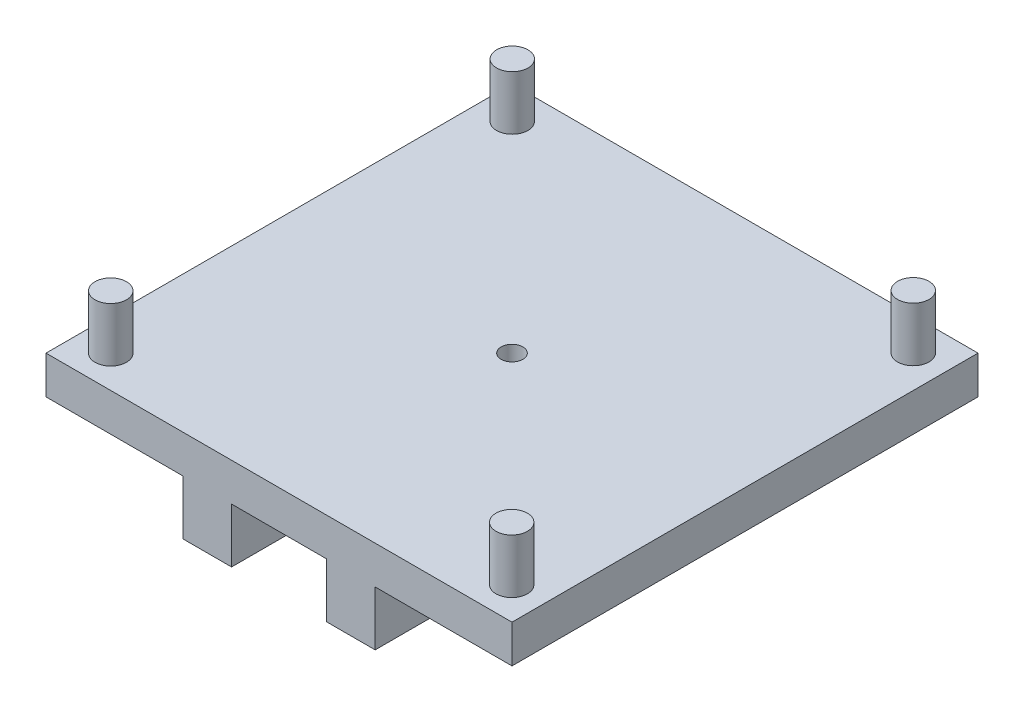
ISO-10303-21;
HEADER;
FILE_DESCRIPTION(('STEP AP214'),'2;1');
FILE_NAME('part.step','',(''),(''),'','','');
FILE_SCHEMA(('AUTOMOTIVE_DESIGN { 1 0 10303 214 1 1 1 1 }'));
ENDSEC;
DATA;
#1=APPLICATION_CONTEXT('core data for automotive mechanical design processes');
#2=APPLICATION_PROTOCOL_DEFINITION('international standard','automotive_design',2000,#1);
#3=PRODUCT_CONTEXT('',#1,'mechanical');
#4=PRODUCT('Part','Part','',(#3));
#5=PRODUCT_RELATED_PRODUCT_CATEGORY('part','',(#4));
#6=PRODUCT_DEFINITION_FORMATION('','',#4);
#7=PRODUCT_DEFINITION_CONTEXT('part definition',#1,'design');
#8=PRODUCT_DEFINITION('design','',#6,#7);
#9=PRODUCT_DEFINITION_SHAPE('','',#8);
#10=(LENGTH_UNIT() NAMED_UNIT(*) SI_UNIT(.MILLI.,.METRE.));
#11=(NAMED_UNIT(*) PLANE_ANGLE_UNIT() SI_UNIT($,.RADIAN.));
#12=(NAMED_UNIT(*) SI_UNIT($,.STERADIAN.) SOLID_ANGLE_UNIT());
#13=UNCERTAINTY_MEASURE_WITH_UNIT(LENGTH_MEASURE(1.E-05),#10,'distance_accuracy_value','');
#14=(GEOMETRIC_REPRESENTATION_CONTEXT(3) GLOBAL_UNCERTAINTY_ASSIGNED_CONTEXT((#13)) GLOBAL_UNIT_ASSIGNED_CONTEXT((#10,
#11,#12)) REPRESENTATION_CONTEXT('',''));
#15=CARTESIAN_POINT('',(0.,0.,0.));
#16=DIRECTION('',(0.,0.,1.));
#17=DIRECTION('',(1.,0.,0.));
#18=AXIS2_PLACEMENT_3D('',#15,#16,#17);
#19=CARTESIAN_POINT('',(0.,0.,0.));
#20=DIRECTION('',(0.,-1.,0.));
#21=DIRECTION('',(0.,0.,-1.));
#22=AXIS2_PLACEMENT_3D('',#19,#20,#21);
#23=PLANE('',#22);
#24=DIRECTION('',(0.,0.,1.));
#25=VECTOR('',#24,1.);
#26=CARTESIAN_POINT('',(4.375,0.,21.5));
#27=LINE('',#26,#25);
#28=CARTESIAN_POINT('',(4.375,0.,-21.5));
#29=VERTEX_POINT('',#28);
#30=CARTESIAN_POINT('',(4.375,0.,21.5));
#31=VERTEX_POINT('',#30);
#32=EDGE_CURVE('E133',#29,#31,#27,.T.);
#33=ORIENTED_EDGE('',*,*,#32,.T.);
#34=DIRECTION('',(1.,0.,0.));
#35=VECTOR('',#34,1.);
#36=CARTESIAN_POINT('',(-21.5,0.,21.5));
#37=LINE('',#36,#35);
#38=CARTESIAN_POINT('',(-4.375,0.,21.5));
#39=VERTEX_POINT('',#38);
#40=EDGE_CURVE('E233',#39,#31,#37,.T.);
#41=ORIENTED_EDGE('',*,*,#40,.F.);
#42=DIRECTION('',(0.,0.,1.));
#43=VECTOR('',#42,1.);
#44=CARTESIAN_POINT('',(-4.375,0.,21.5));
#45=LINE('',#44,#43);
#46=CARTESIAN_POINT('',(-4.375,0.,-21.5));
#47=VERTEX_POINT('',#46);
#48=EDGE_CURVE('E135',#47,#39,#45,.T.);
#49=ORIENTED_EDGE('',*,*,#48,.F.);
#50=DIRECTION('',(-1.,0.,0.));
#51=VECTOR('',#50,1.);
#52=CARTESIAN_POINT('',(-21.5,0.,-21.5));
#53=LINE('',#52,#51);
#54=EDGE_CURVE('E60',#29,#47,#53,.T.);
#55=ORIENTED_EDGE('',*,*,#54,.F.);
#56=EDGE_LOOP('',(#33,#41,#49,#55));
#57=FACE_BOUND('',#56,.T.);
#58=CARTESIAN_POINT('',(0.,0.,0.));
#59=DIRECTION('',(0.,1.,0.));
#60=DIRECTION('',(0.,0.,1.));
#61=AXIS2_PLACEMENT_3D('',#58,#59,#60);
#62=CIRCLE('',#61,1.);
#63=CARTESIAN_POINT('',(0.,0.,1.));
#64=VERTEX_POINT('',#63);
#65=EDGE_CURVE('E205',#64,#64,#62,.T.);
#66=ORIENTED_EDGE('',*,*,#65,.T.);
#67=EDGE_LOOP('',(#66));
#68=FACE_BOUND('',#67,.T.);
#69=ADVANCED_FACE('F37',(#57,#68),#23,.T.);
#70=DIRECTION('',(0.,0.,-1.));
#71=VECTOR('',#70,1.);
#72=CARTESIAN_POINT('',(8.875,0.,21.5));
#73=LINE('',#72,#71);
#74=CARTESIAN_POINT('',(8.875,0.,21.5));
#75=VERTEX_POINT('',#74);
#76=CARTESIAN_POINT('',(8.87499999999999,0.,-21.5));
#77=VERTEX_POINT('',#76);
#78=EDGE_CURVE('E52',#75,#77,#73,.T.);
#79=ORIENTED_EDGE('',*,*,#78,.T.);
#80=CARTESIAN_POINT('',(21.5,0.,-21.5));
#81=VERTEX_POINT('',#80);
#82=EDGE_CURVE('E226',#81,#77,#53,.T.);
#83=ORIENTED_EDGE('',*,*,#82,.F.);
#84=DIRECTION('',(0.,0.,-1.));
#85=VECTOR('',#84,1.);
#86=CARTESIAN_POINT('',(21.5,0.,21.5));
#87=LINE('',#86,#85);
#88=CARTESIAN_POINT('',(21.5,0.,21.5));
#89=VERTEX_POINT('',#88);
#90=EDGE_CURVE('E209',#89,#81,#87,.T.);
#91=ORIENTED_EDGE('',*,*,#90,.F.);
#92=EDGE_CURVE('E230',#75,#89,#37,.T.);
#93=ORIENTED_EDGE('',*,*,#92,.F.);
#94=EDGE_LOOP('',(#79,#83,#91,#93));
#95=FACE_BOUND('',#94,.T.);
#96=ADVANCED_FACE('F253',(#95),#23,.T.);
#97=CARTESIAN_POINT('',(0.,3.5,0.));
#98=DIRECTION('',(0.,-1.,0.));
#99=DIRECTION('',(0.,0.,-1.));
#100=AXIS2_PLACEMENT_3D('',#97,#98,#99);
#101=PLANE('',#100);
#102=CARTESIAN_POINT('',(18.5,3.5,18.5270414754577));
#103=DIRECTION('',(0.,-1.,0.));
#104=DIRECTION('',(0.,0.,-1.));
#105=AXIS2_PLACEMENT_3D('',#102,#103,#104);
#106=CIRCLE('',#105,1.45);
#107=CARTESIAN_POINT('',(18.5,3.5,17.0770414754577));
#108=VERTEX_POINT('',#107);
#109=EDGE_CURVE('E11',#108,#108,#106,.F.);
#110=ORIENTED_EDGE('',*,*,#109,.F.);
#111=EDGE_LOOP('',(#110));
#112=FACE_BOUND('',#111,.T.);
#113=CARTESIAN_POINT('',(-18.5,3.5,18.5270414754577));
#114=DIRECTION('',(0.,-1.,0.));
#115=DIRECTION('',(0.,0.,-1.));
#116=AXIS2_PLACEMENT_3D('',#113,#114,#115);
#117=CIRCLE('',#116,1.45);
#118=CARTESIAN_POINT('',(-18.5,3.5,17.0770414754577));
#119=VERTEX_POINT('',#118);
#120=EDGE_CURVE('E190',#119,#119,#117,.T.);
#121=ORIENTED_EDGE('',*,*,#120,.T.);
#122=EDGE_LOOP('',(#121));
#123=FACE_BOUND('',#122,.T.);
#124=CARTESIAN_POINT('',(18.5,3.5,-18.5270414754577));
#125=DIRECTION('',(0.,-1.,0.));
#126=DIRECTION('',(0.,0.,1.));
#127=AXIS2_PLACEMENT_3D('',#124,#125,#126);
#128=CIRCLE('',#127,1.45);
#129=CARTESIAN_POINT('',(18.5,3.5,-17.0770414754577));
#130=VERTEX_POINT('',#129);
#131=EDGE_CURVE('E194',#130,#130,#128,.T.);
#132=ORIENTED_EDGE('',*,*,#131,.T.);
#133=EDGE_LOOP('',(#132));
#134=FACE_BOUND('',#133,.T.);
#135=CARTESIAN_POINT('',(-18.5,3.5,-18.5270414754577));
#136=DIRECTION('',(0.,-1.,0.));
#137=DIRECTION('',(0.,0.,-1.));
#138=AXIS2_PLACEMENT_3D('',#135,#136,#137);
#139=CIRCLE('',#138,1.45);
#140=CARTESIAN_POINT('',(-18.5,3.5,-19.9770414754577));
#141=VERTEX_POINT('',#140);
#142=EDGE_CURVE('E45',#141,#141,#139,.F.);
#143=ORIENTED_EDGE('',*,*,#142,.F.);
#144=EDGE_LOOP('',(#143));
#145=FACE_BOUND('',#144,.T.);
#146=DIRECTION('',(0.,0.,-1.));
#147=VECTOR('',#146,1.);
#148=CARTESIAN_POINT('',(21.5,3.5,21.5));
#149=LINE('',#148,#147);
#150=CARTESIAN_POINT('',(21.5,3.5,21.5));
#151=VERTEX_POINT('',#150);
#152=CARTESIAN_POINT('',(21.5,3.5,-21.5));
#153=VERTEX_POINT('',#152);
#154=EDGE_CURVE('E212',#151,#153,#149,.T.);
#155=ORIENTED_EDGE('',*,*,#154,.T.);
#156=DIRECTION('',(-1.,0.,0.));
#157=VECTOR('',#156,1.);
#158=CARTESIAN_POINT('',(-21.5,3.5,-21.5));
#159=LINE('',#158,#157);
#160=CARTESIAN_POINT('',(-21.5,3.5,-21.5));
#161=VERTEX_POINT('',#160);
#162=EDGE_CURVE('E215',#153,#161,#159,.T.);
#163=ORIENTED_EDGE('',*,*,#162,.T.);
#164=DIRECTION('',(0.,0.,1.));
#165=VECTOR('',#164,1.);
#166=CARTESIAN_POINT('',(-21.5,3.5,21.5));
#167=LINE('',#166,#165);
#168=CARTESIAN_POINT('',(-21.5,3.5,21.5));
#169=VERTEX_POINT('',#168);
#170=EDGE_CURVE('E218',#161,#169,#167,.T.);
#171=ORIENTED_EDGE('',*,*,#170,.T.);
#172=DIRECTION('',(1.,0.,0.));
#173=VECTOR('',#172,1.);
#174=CARTESIAN_POINT('',(-21.5,3.5,21.5));
#175=LINE('',#174,#173);
#176=EDGE_CURVE('E220',#169,#151,#175,.T.);
#177=ORIENTED_EDGE('',*,*,#176,.T.);
#178=EDGE_LOOP('',(#155,#163,#171,#177));
#179=FACE_BOUND('',#178,.T.);
#180=CARTESIAN_POINT('',(0.,3.5,0.));
#181=DIRECTION('',(0.,1.,0.));
#182=DIRECTION('',(0.,0.,1.));
#183=AXIS2_PLACEMENT_3D('',#180,#181,#182);
#184=CIRCLE('',#183,1.);
#185=CARTESIAN_POINT('',(0.,3.5,1.));
#186=VERTEX_POINT('',#185);
#187=EDGE_CURVE('E206',#186,#186,#184,.T.);
#188=ORIENTED_EDGE('',*,*,#187,.F.);
#189=EDGE_LOOP('',(#188));
#190=FACE_BOUND('',#189,.T.);
#191=ADVANCED_FACE('F249',(#112,#123,#134,#145,#179,#190),#101,.F.);
#192=DIRECTION('',(0.,0.,-1.));
#193=VECTOR('',#192,1.);
#194=CARTESIAN_POINT('',(-8.875,0.,21.5));
#195=LINE('',#194,#193);
#196=CARTESIAN_POINT('',(-8.875,0.,21.5));
#197=VERTEX_POINT('',#196);
#198=CARTESIAN_POINT('',(-8.87499999999999,0.,-21.5));
#199=VERTEX_POINT('',#198);
#200=EDGE_CURVE('E165',#197,#199,#195,.T.);
#201=ORIENTED_EDGE('',*,*,#200,.F.);
#202=CARTESIAN_POINT('',(-21.5,0.,21.5));
#203=VERTEX_POINT('',#202);
#204=EDGE_CURVE('E216',#203,#197,#37,.T.);
#205=ORIENTED_EDGE('',*,*,#204,.F.);
#206=DIRECTION('',(0.,0.,1.));
#207=VECTOR('',#206,1.);
#208=CARTESIAN_POINT('',(-21.5,0.,21.5));
#209=LINE('',#208,#207);
#210=CARTESIAN_POINT('',(-21.5,0.,-21.5));
#211=VERTEX_POINT('',#210);
#212=EDGE_CURVE('E228',#211,#203,#209,.T.);
#213=ORIENTED_EDGE('',*,*,#212,.F.);
#214=EDGE_CURVE('E225',#199,#211,#53,.T.);
#215=ORIENTED_EDGE('',*,*,#214,.F.);
#216=EDGE_LOOP('',(#201,#205,#213,#215));
#217=FACE_BOUND('',#216,.T.);
#218=ADVANCED_FACE('F252',(#217),#23,.T.);
#219=CARTESIAN_POINT('',(21.5,3.5,21.5));
#220=DIRECTION('',(-1.,0.,0.));
#221=DIRECTION('',(0.,0.,1.));
#222=AXIS2_PLACEMENT_3D('',#219,#220,#221);
#223=PLANE('',#222);
#224=ORIENTED_EDGE('',*,*,#90,.T.);
#225=DIRECTION('',(0.,-1.,0.));
#226=VECTOR('',#225,1.);
#227=CARTESIAN_POINT('',(21.5,3.5,-21.5));
#228=LINE('',#227,#226);
#229=EDGE_CURVE('E242',#153,#81,#228,.T.);
#230=ORIENTED_EDGE('',*,*,#229,.F.);
#231=ORIENTED_EDGE('',*,*,#154,.F.);
#232=DIRECTION('',(0.,-1.,0.));
#233=VECTOR('',#232,1.);
#234=CARTESIAN_POINT('',(21.5,3.5,21.5));
#235=LINE('',#234,#233);
#236=EDGE_CURVE('E222',#151,#89,#235,.T.);
#237=ORIENTED_EDGE('',*,*,#236,.T.);
#238=EDGE_LOOP('',(#224,#230,#231,#237));
#239=FACE_BOUND('',#238,.T.);
#240=ADVANCED_FACE('F39',(#239),#223,.F.);
#241=CARTESIAN_POINT('',(-21.5,3.5,-21.5));
#242=DIRECTION('',(0.,0.,1.));
#243=DIRECTION('',(1.,0.,0.));
#244=AXIS2_PLACEMENT_3D('',#241,#242,#243);
#245=PLANE('',#244);
#246=ORIENTED_EDGE('',*,*,#82,.T.);
#247=DIRECTION('',(0.,1.,0.));
#248=VECTOR('',#247,1.);
#249=CARTESIAN_POINT('',(8.87499999999999,-5.03,-21.5));
#250=LINE('',#249,#248);
#251=CARTESIAN_POINT('',(8.87499999999999,-5.03,-21.5));
#252=VERTEX_POINT('',#251);
#253=EDGE_CURVE('E136',#252,#77,#250,.T.);
#254=ORIENTED_EDGE('',*,*,#253,.F.);
#255=DIRECTION('',(-1.,0.,0.));
#256=VECTOR('',#255,1.);
#257=CARTESIAN_POINT('',(4.375,-5.03,-21.5));
#258=LINE('',#257,#256);
#259=CARTESIAN_POINT('',(4.375,-5.03,-21.5));
#260=VERTEX_POINT('',#259);
#261=EDGE_CURVE('E142',#252,#260,#258,.T.);
#262=ORIENTED_EDGE('',*,*,#261,.T.);
#263=DIRECTION('',(0.,1.,0.));
#264=VECTOR('',#263,1.);
#265=CARTESIAN_POINT('',(4.375,-5.03,-21.5));
#266=LINE('',#265,#264);
#267=EDGE_CURVE('E127',#260,#29,#266,.T.);
#268=ORIENTED_EDGE('',*,*,#267,.T.);
#269=ORIENTED_EDGE('',*,*,#54,.T.);
#270=DIRECTION('',(0.,1.,0.));
#271=VECTOR('',#270,1.);
#272=CARTESIAN_POINT('',(-4.375,-5.03,-21.5));
#273=LINE('',#272,#271);
#274=CARTESIAN_POINT('',(-4.375,-5.03,-21.5));
#275=VERTEX_POINT('',#274);
#276=EDGE_CURVE('E171',#275,#47,#273,.T.);
#277=ORIENTED_EDGE('',*,*,#276,.F.);
#278=DIRECTION('',(1.,0.,0.));
#279=VECTOR('',#278,1.);
#280=CARTESIAN_POINT('',(-4.375,-5.03,-21.5));
#281=LINE('',#280,#279);
#282=CARTESIAN_POINT('',(-8.87499999999999,-5.03,-21.5));
#283=VERTEX_POINT('',#282);
#284=EDGE_CURVE('E169',#283,#275,#281,.T.);
#285=ORIENTED_EDGE('',*,*,#284,.F.);
#286=DIRECTION('',(0.,1.,0.));
#287=VECTOR('',#286,1.);
#288=CARTESIAN_POINT('',(-8.87499999999999,-5.03,-21.5));
#289=LINE('',#288,#287);
#290=EDGE_CURVE('E178',#283,#199,#289,.T.);
#291=ORIENTED_EDGE('',*,*,#290,.T.);
#292=ORIENTED_EDGE('',*,*,#214,.T.);
#293=DIRECTION('',(0.,-1.,0.));
#294=VECTOR('',#293,1.);
#295=CARTESIAN_POINT('',(-21.5,3.5,-21.5));
#296=LINE('',#295,#294);
#297=EDGE_CURVE('E239',#161,#211,#296,.T.);
#298=ORIENTED_EDGE('',*,*,#297,.F.);
#299=ORIENTED_EDGE('',*,*,#162,.F.);
#300=ORIENTED_EDGE('',*,*,#229,.T.);
#301=EDGE_LOOP('',(#246,#254,#262,#268,#269,#277,#285,#291,#292,#298,#299,#300));
#302=FACE_BOUND('',#301,.T.);
#303=ADVANCED_FACE('F148',(#302),#245,.F.);
#304=CARTESIAN_POINT('',(-21.5,3.5,21.5));
#305=DIRECTION('',(1.,0.,0.));
#306=DIRECTION('',(0.,0.,-1.));
#307=AXIS2_PLACEMENT_3D('',#304,#305,#306);
#308=PLANE('',#307);
#309=ORIENTED_EDGE('',*,*,#212,.T.);
#310=DIRECTION('',(0.,-1.,0.));
#311=VECTOR('',#310,1.);
#312=CARTESIAN_POINT('',(-21.5,3.5,21.5));
#313=LINE('',#312,#311);
#314=EDGE_CURVE('E236',#169,#203,#313,.T.);
#315=ORIENTED_EDGE('',*,*,#314,.F.);
#316=ORIENTED_EDGE('',*,*,#170,.F.);
#317=ORIENTED_EDGE('',*,*,#297,.T.);
#318=EDGE_LOOP('',(#309,#315,#316,#317));
#319=FACE_BOUND('',#318,.T.);
#320=ADVANCED_FACE('F306',(#319),#308,.F.);
#321=CARTESIAN_POINT('',(-21.5,3.5,21.5));
#322=DIRECTION('',(0.,0.,-1.));
#323=DIRECTION('',(-1.,0.,0.));
#324=AXIS2_PLACEMENT_3D('',#321,#322,#323);
#325=PLANE('',#324);
#326=ORIENTED_EDGE('',*,*,#204,.T.);
#327=DIRECTION('',(0.,1.,0.));
#328=VECTOR('',#327,1.);
#329=CARTESIAN_POINT('',(-8.875,-5.03,21.5));
#330=LINE('',#329,#328);
#331=CARTESIAN_POINT('',(-8.875,-5.03,21.5));
#332=VERTEX_POINT('',#331);
#333=EDGE_CURVE('E181',#332,#197,#330,.T.);
#334=ORIENTED_EDGE('',*,*,#333,.F.);
#335=DIRECTION('',(-1.,0.,0.));
#336=VECTOR('',#335,1.);
#337=CARTESIAN_POINT('',(-4.375,-5.03,21.5));
#338=LINE('',#337,#336);
#339=CARTESIAN_POINT('',(-4.375,-5.03,21.5));
#340=VERTEX_POINT('',#339);
#341=EDGE_CURVE('E164',#340,#332,#338,.T.);
#342=ORIENTED_EDGE('',*,*,#341,.F.);
#343=DIRECTION('',(0.,1.,0.));
#344=VECTOR('',#343,1.);
#345=CARTESIAN_POINT('',(-4.375,-5.03,21.5));
#346=LINE('',#345,#344);
#347=EDGE_CURVE('E184',#340,#39,#346,.T.);
#348=ORIENTED_EDGE('',*,*,#347,.T.);
#349=ORIENTED_EDGE('',*,*,#40,.T.);
#350=DIRECTION('',(0.,1.,0.));
#351=VECTOR('',#350,1.);
#352=CARTESIAN_POINT('',(4.375,-5.03,21.5));
#353=LINE('',#352,#351);
#354=CARTESIAN_POINT('',(4.375,-5.03,21.5));
#355=VERTEX_POINT('',#354);
#356=EDGE_CURVE('E154',#355,#31,#353,.T.);
#357=ORIENTED_EDGE('',*,*,#356,.F.);
#358=DIRECTION('',(1.,0.,0.));
#359=VECTOR('',#358,1.);
#360=CARTESIAN_POINT('',(4.375,-5.03,21.5));
#361=LINE('',#360,#359);
#362=CARTESIAN_POINT('',(8.875,-5.03,21.5));
#363=VERTEX_POINT('',#362);
#364=EDGE_CURVE('E145',#355,#363,#361,.T.);
#365=ORIENTED_EDGE('',*,*,#364,.T.);
#366=DIRECTION('',(0.,1.,0.));
#367=VECTOR('',#366,1.);
#368=CARTESIAN_POINT('',(8.875,-5.03,21.5));
#369=LINE('',#368,#367);
#370=EDGE_CURVE('E158',#363,#75,#369,.T.);
#371=ORIENTED_EDGE('',*,*,#370,.T.);
#372=ORIENTED_EDGE('',*,*,#92,.T.);
#373=ORIENTED_EDGE('',*,*,#236,.F.);
#374=ORIENTED_EDGE('',*,*,#176,.F.);
#375=ORIENTED_EDGE('',*,*,#314,.T.);
#376=EDGE_LOOP('',(#326,#334,#342,#348,#349,#357,#365,#371,#372,#373,#374,#375));
#377=FACE_BOUND('',#376,.T.);
#378=ADVANCED_FACE('F264',(#377),#325,.F.);
#379=CARTESIAN_POINT('',(0.,3.5,0.));
#380=DIRECTION('',(0.,-1.,0.));
#381=DIRECTION('',(0.,0.,-1.));
#382=AXIS2_PLACEMENT_3D('',#379,#380,#381);
#383=CYLINDRICAL_SURFACE('',#382,1.);
#384=ORIENTED_EDGE('',*,*,#187,.T.);
#385=EDGE_LOOP('',(#384));
#386=FACE_BOUND('',#385,.T.);
#387=ORIENTED_EDGE('',*,*,#65,.F.);
#388=EDGE_LOOP('',(#387));
#389=FACE_BOUND('',#388,.T.);
#390=ADVANCED_FACE('F261',(#386,#389),#383,.F.);
#391=CARTESIAN_POINT('',(-18.5,8.5,-18.5270414754577));
#392=DIRECTION('',(0.,-1.,0.));
#393=DIRECTION('',(0.,0.,-1.));
#394=AXIS2_PLACEMENT_3D('',#391,#392,#393);
#395=CYLINDRICAL_SURFACE('',#394,1.45);
#396=CARTESIAN_POINT('',(-18.5,8.5,-18.5270414754577));
#397=DIRECTION('',(0.,1.,0.));
#398=DIRECTION('',(0.,0.,1.));
#399=AXIS2_PLACEMENT_3D('',#396,#397,#398);
#400=CIRCLE('',#399,1.45);
#401=CARTESIAN_POINT('',(-18.5,8.5,-17.0770414754577));
#402=VERTEX_POINT('',#401);
#403=EDGE_CURVE('E200',#402,#402,#400,.T.);
#404=ORIENTED_EDGE('',*,*,#403,.F.);
#405=EDGE_LOOP('',(#404));
#406=FACE_BOUND('',#405,.T.);
#407=ORIENTED_EDGE('',*,*,#142,.T.);
#408=EDGE_LOOP('',(#407));
#409=FACE_BOUND('',#408,.T.);
#410=ADVANCED_FACE('F247',(#406,#409),#395,.T.);
#411=CARTESIAN_POINT('',(-18.5,8.5,-18.5270414754577));
#412=DIRECTION('',(0.,1.,0.));
#413=DIRECTION('',(0.,0.,1.));
#414=AXIS2_PLACEMENT_3D('',#411,#412,#413);
#415=PLANE('',#414);
#416=ORIENTED_EDGE('',*,*,#403,.T.);
#417=EDGE_LOOP('',(#416));
#418=FACE_BOUND('',#417,.T.);
#419=ADVANCED_FACE('F346',(#418),#415,.T.);
#420=CARTESIAN_POINT('',(18.5,8.5,-18.5270414754577));
#421=DIRECTION('',(0.,-1.,0.));
#422=DIRECTION('',(0.,0.,-1.));
#423=AXIS2_PLACEMENT_3D('',#420,#421,#422);
#424=CYLINDRICAL_SURFACE('',#423,1.45);
#425=CARTESIAN_POINT('',(18.5,8.5,-18.5270414754577));
#426=DIRECTION('',(0.,-1.,0.));
#427=DIRECTION('',(0.,0.,1.));
#428=AXIS2_PLACEMENT_3D('',#425,#426,#427);
#429=CIRCLE('',#428,1.45);
#430=CARTESIAN_POINT('',(18.5,8.5,-17.0770414754577));
#431=VERTEX_POINT('',#430);
#432=EDGE_CURVE('E197',#431,#431,#429,.T.);
#433=ORIENTED_EDGE('',*,*,#432,.T.);
#434=EDGE_LOOP('',(#433));
#435=FACE_BOUND('',#434,.T.);
#436=ORIENTED_EDGE('',*,*,#131,.F.);
#437=EDGE_LOOP('',(#436));
#438=FACE_BOUND('',#437,.T.);
#439=ADVANCED_FACE('F357',(#435,#438),#424,.T.);
#440=CARTESIAN_POINT('',(18.5,8.5,-18.5270414754577));
#441=DIRECTION('',(0.,1.,0.));
#442=DIRECTION('',(0.,0.,1.));
#443=AXIS2_PLACEMENT_3D('',#440,#441,#442);
#444=PLANE('',#443);
#445=ORIENTED_EDGE('',*,*,#432,.F.);
#446=EDGE_LOOP('',(#445));
#447=FACE_BOUND('',#446,.T.);
#448=ADVANCED_FACE('F375',(#447),#444,.T.);
#449=CARTESIAN_POINT('',(-18.5,8.5,18.5270414754577));
#450=DIRECTION('',(0.,-1.,0.));
#451=DIRECTION('',(0.,0.,-1.));
#452=AXIS2_PLACEMENT_3D('',#449,#450,#451);
#453=CYLINDRICAL_SURFACE('',#452,1.45);
#454=CARTESIAN_POINT('',(-18.5,8.5,18.5270414754577));
#455=DIRECTION('',(0.,-1.,0.));
#456=DIRECTION('',(0.,0.,-1.));
#457=AXIS2_PLACEMENT_3D('',#454,#455,#456);
#458=CIRCLE('',#457,1.45);
#459=CARTESIAN_POINT('',(-18.5,8.5,17.0770414754577));
#460=VERTEX_POINT('',#459);
#461=EDGE_CURVE('E191',#460,#460,#458,.T.);
#462=ORIENTED_EDGE('',*,*,#461,.T.);
#463=EDGE_LOOP('',(#462));
#464=FACE_BOUND('',#463,.T.);
#465=ORIENTED_EDGE('',*,*,#120,.F.);
#466=EDGE_LOOP('',(#465));
#467=FACE_BOUND('',#466,.T.);
#468=ADVANCED_FACE('F386',(#464,#467),#453,.T.);
#469=CARTESIAN_POINT('',(-18.5,8.5,18.5270414754577));
#470=DIRECTION('',(0.,1.,0.));
#471=DIRECTION('',(0.,0.,-1.));
#472=AXIS2_PLACEMENT_3D('',#469,#470,#471);
#473=PLANE('',#472);
#474=ORIENTED_EDGE('',*,*,#461,.F.);
#475=EDGE_LOOP('',(#474));
#476=FACE_BOUND('',#475,.T.);
#477=ADVANCED_FACE('F397',(#476),#473,.T.);
#478=CARTESIAN_POINT('',(18.5,8.5,18.5270414754577));
#479=DIRECTION('',(0.,-1.,0.));
#480=DIRECTION('',(0.,0.,-1.));
#481=AXIS2_PLACEMENT_3D('',#478,#479,#480);
#482=CYLINDRICAL_SURFACE('',#481,1.45);
#483=CARTESIAN_POINT('',(18.5,8.5,18.5270414754577));
#484=DIRECTION('',(0.,1.,0.));
#485=DIRECTION('',(0.,0.,-1.));
#486=AXIS2_PLACEMENT_3D('',#483,#484,#485);
#487=CIRCLE('',#486,1.45);
#488=CARTESIAN_POINT('',(18.5,8.5,17.0770414754577));
#489=VERTEX_POINT('',#488);
#490=EDGE_CURVE('E187',#489,#489,#487,.T.);
#491=ORIENTED_EDGE('',*,*,#490,.F.);
#492=EDGE_LOOP('',(#491));
#493=FACE_BOUND('',#492,.T.);
#494=ORIENTED_EDGE('',*,*,#109,.T.);
#495=EDGE_LOOP('',(#494));
#496=FACE_BOUND('',#495,.T.);
#497=ADVANCED_FACE('F408',(#493,#496),#482,.T.);
#498=CARTESIAN_POINT('',(18.5,8.5,18.5270414754577));
#499=DIRECTION('',(0.,1.,0.));
#500=DIRECTION('',(0.,0.,-1.));
#501=AXIS2_PLACEMENT_3D('',#498,#499,#500);
#502=PLANE('',#501);
#503=ORIENTED_EDGE('',*,*,#490,.T.);
#504=EDGE_LOOP('',(#503));
#505=FACE_BOUND('',#504,.T.);
#506=ADVANCED_FACE('F419',(#505),#502,.T.);
#507=CARTESIAN_POINT('',(-4.375,-5.03,21.5));
#508=DIRECTION('',(-1.,0.,0.));
#509=DIRECTION('',(0.,0.,1.));
#510=AXIS2_PLACEMENT_3D('',#507,#508,#509);
#511=PLANE('',#510);
#512=ORIENTED_EDGE('',*,*,#48,.T.);
#513=ORIENTED_EDGE('',*,*,#347,.F.);
#514=DIRECTION('',(0.,0.,1.));
#515=VECTOR('',#514,1.);
#516=CARTESIAN_POINT('',(-4.375,-5.03,21.5));
#517=LINE('',#516,#515);
#518=EDGE_CURVE('E161',#275,#340,#517,.T.);
#519=ORIENTED_EDGE('',*,*,#518,.F.);
#520=ORIENTED_EDGE('',*,*,#276,.T.);
#521=EDGE_LOOP('',(#512,#513,#519,#520));
#522=FACE_BOUND('',#521,.T.);
#523=ADVANCED_FACE('F299',(#522),#511,.F.);
#524=CARTESIAN_POINT('',(-8.875,-5.03,21.5));
#525=DIRECTION('',(1.,0.,0.));
#526=DIRECTION('',(0.,0.,-1.));
#527=AXIS2_PLACEMENT_3D('',#524,#525,#526);
#528=PLANE('',#527);
#529=ORIENTED_EDGE('',*,*,#200,.T.);
#530=ORIENTED_EDGE('',*,*,#290,.F.);
#531=DIRECTION('',(0.,0.,-1.));
#532=VECTOR('',#531,1.);
#533=CARTESIAN_POINT('',(-8.875,-5.03,21.5));
#534=LINE('',#533,#532);
#535=EDGE_CURVE('E167',#332,#283,#534,.T.);
#536=ORIENTED_EDGE('',*,*,#535,.F.);
#537=ORIENTED_EDGE('',*,*,#333,.T.);
#538=EDGE_LOOP('',(#529,#530,#536,#537));
#539=FACE_BOUND('',#538,.T.);
#540=ADVANCED_FACE('F291',(#539),#528,.F.);
#541=CARTESIAN_POINT('',(0.,-5.03,0.));
#542=DIRECTION('',(0.,1.,0.));
#543=DIRECTION('',(0.,0.,1.));
#544=AXIS2_PLACEMENT_3D('',#541,#542,#543);
#545=PLANE('',#544);
#546=ORIENTED_EDGE('',*,*,#518,.T.);
#547=ORIENTED_EDGE('',*,*,#341,.T.);
#548=ORIENTED_EDGE('',*,*,#535,.T.);
#549=ORIENTED_EDGE('',*,*,#284,.T.);
#550=EDGE_LOOP('',(#546,#547,#548,#549));
#551=FACE_BOUND('',#550,.T.);
#552=ADVANCED_FACE('F294',(#551),#545,.F.);
#553=CARTESIAN_POINT('',(4.375,-5.03,21.5));
#554=DIRECTION('',(-1.,0.,0.));
#555=DIRECTION('',(0.,0.,1.));
#556=AXIS2_PLACEMENT_3D('',#553,#554,#555);
#557=PLANE('',#556);
#558=ORIENTED_EDGE('',*,*,#32,.F.);
#559=ORIENTED_EDGE('',*,*,#267,.F.);
#560=DIRECTION('',(0.,0.,1.));
#561=VECTOR('',#560,1.);
#562=CARTESIAN_POINT('',(4.375,-5.03,21.5));
#563=LINE('',#562,#561);
#564=EDGE_CURVE('E130',#260,#355,#563,.T.);
#565=ORIENTED_EDGE('',*,*,#564,.T.);
#566=ORIENTED_EDGE('',*,*,#356,.T.);
#567=EDGE_LOOP('',(#558,#559,#565,#566));
#568=FACE_BOUND('',#567,.T.);
#569=ADVANCED_FACE('F129',(#568),#557,.T.);
#570=CARTESIAN_POINT('',(8.875,-5.03,21.5));
#571=DIRECTION('',(1.,0.,0.));
#572=DIRECTION('',(0.,0.,-1.));
#573=AXIS2_PLACEMENT_3D('',#570,#571,#572);
#574=PLANE('',#573);
#575=ORIENTED_EDGE('',*,*,#78,.F.);
#576=ORIENTED_EDGE('',*,*,#370,.F.);
#577=DIRECTION('',(0.,0.,-1.));
#578=VECTOR('',#577,1.);
#579=CARTESIAN_POINT('',(8.875,-5.03,21.5));
#580=LINE('',#579,#578);
#581=EDGE_CURVE('E149',#363,#252,#580,.T.);
#582=ORIENTED_EDGE('',*,*,#581,.T.);
#583=ORIENTED_EDGE('',*,*,#253,.T.);
#584=EDGE_LOOP('',(#575,#576,#582,#583));
#585=FACE_BOUND('',#584,.T.);
#586=ADVANCED_FACE('F490',(#585),#574,.T.);
#587=CARTESIAN_POINT('',(0.,-5.03,0.));
#588=DIRECTION('',(0.,1.,0.));
#589=DIRECTION('',(0.,0.,1.));
#590=AXIS2_PLACEMENT_3D('',#587,#588,#589);
#591=PLANE('',#590);
#592=ORIENTED_EDGE('',*,*,#564,.F.);
#593=ORIENTED_EDGE('',*,*,#261,.F.);
#594=ORIENTED_EDGE('',*,*,#581,.F.);
#595=ORIENTED_EDGE('',*,*,#364,.F.);
#596=EDGE_LOOP('',(#592,#593,#594,#595));
#597=FACE_BOUND('',#596,.T.);
#598=ADVANCED_FACE('F140',(#597),#591,.F.);
#599=CLOSED_SHELL('',(#69,#96,#191,#218,#240,#303,#320,#378,#390,#410,#419,#439,#448,#468,#477,
#497,#506,#523,#540,#552,#569,#586,#598));
#600=MANIFOLD_SOLID_BREP('B2',#599);
#601=ADVANCED_BREP_SHAPE_REPRESENTATION('',(#18,#600),#14);
#602=SHAPE_DEFINITION_REPRESENTATION(#9,#601);
ENDSEC;
END-ISO-10303-21;
